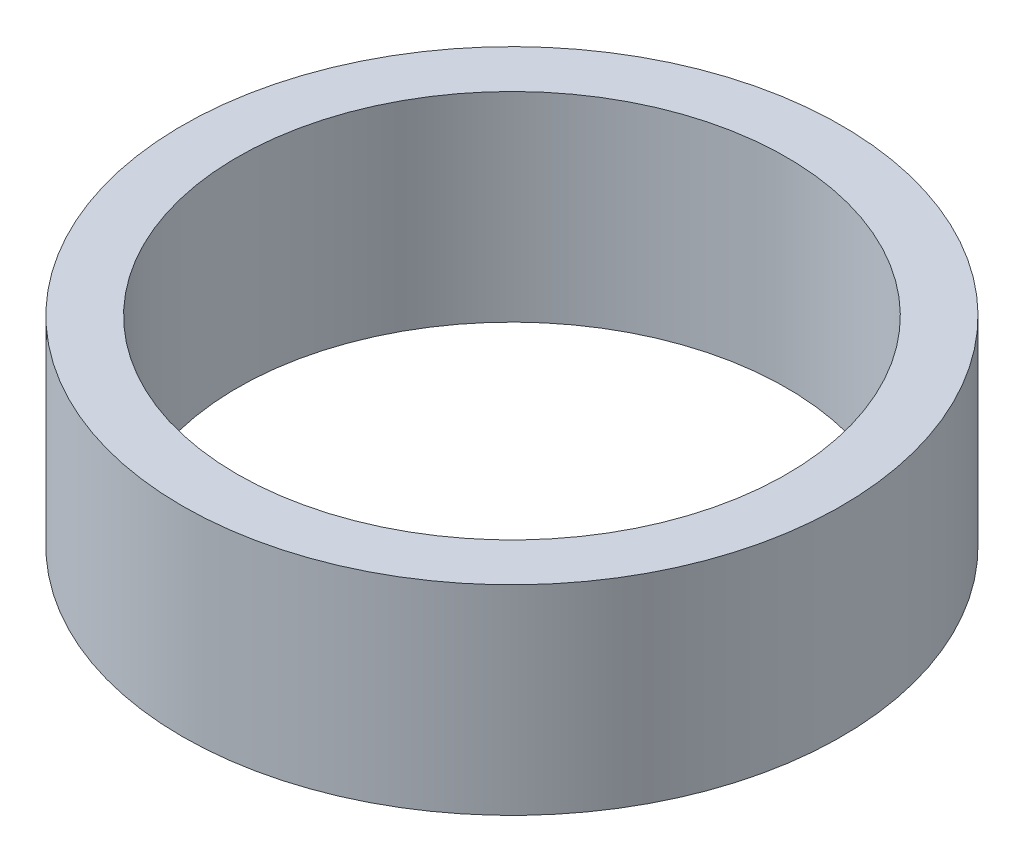
ISO-10303-21;
HEADER;
FILE_DESCRIPTION(('STEP AP214'),'2;1');
FILE_NAME('part.step','',(''),(''),'','','');
FILE_SCHEMA(('AUTOMOTIVE_DESIGN { 1 0 10303 214 1 1 1 1 }'));
ENDSEC;
DATA;
#1=APPLICATION_CONTEXT('core data for automotive mechanical design processes');
#2=APPLICATION_PROTOCOL_DEFINITION('international standard','automotive_design',2000,#1);
#3=PRODUCT_CONTEXT('',#1,'mechanical');
#4=PRODUCT('Part','Part','',(#3));
#5=PRODUCT_RELATED_PRODUCT_CATEGORY('part','',(#4));
#6=PRODUCT_DEFINITION_FORMATION('','',#4);
#7=PRODUCT_DEFINITION_CONTEXT('part definition',#1,'design');
#8=PRODUCT_DEFINITION('design','',#6,#7);
#9=PRODUCT_DEFINITION_SHAPE('','',#8);
#10=(LENGTH_UNIT() NAMED_UNIT(*) SI_UNIT(.MILLI.,.METRE.));
#11=(NAMED_UNIT(*) PLANE_ANGLE_UNIT() SI_UNIT($,.RADIAN.));
#12=(NAMED_UNIT(*) SI_UNIT($,.STERADIAN.) SOLID_ANGLE_UNIT());
#13=UNCERTAINTY_MEASURE_WITH_UNIT(LENGTH_MEASURE(1.E-05),#10,'distance_accuracy_value','');
#14=(GEOMETRIC_REPRESENTATION_CONTEXT(3) GLOBAL_UNCERTAINTY_ASSIGNED_CONTEXT((#13)) GLOBAL_UNIT_ASSIGNED_CONTEXT((#10,
#11,#12)) REPRESENTATION_CONTEXT('',''));
#15=CARTESIAN_POINT('',(0.,0.,0.));
#16=DIRECTION('',(0.,0.,1.));
#17=DIRECTION('',(1.,0.,0.));
#18=AXIS2_PLACEMENT_3D('',#15,#16,#17);
#19=CARTESIAN_POINT('',(0.,10.,0.));
#20=DIRECTION('',(0.,1.,0.));
#21=DIRECTION('',(0.,0.,1.));
#22=AXIS2_PLACEMENT_3D('',#19,#20,#21);
#23=PLANE('',#22);
#24=CARTESIAN_POINT('',(0.,10.,0.));
#25=DIRECTION('',(0.,1.,0.));
#26=DIRECTION('',(0.,0.,1.));
#27=AXIS2_PLACEMENT_3D('',#24,#25,#26);
#28=CIRCLE('',#27,16.5);
#29=CARTESIAN_POINT('',(0.,10.,16.5));
#30=VERTEX_POINT('',#29);
#31=EDGE_CURVE('E10',#30,#30,#28,.T.);
#32=ORIENTED_EDGE('',*,*,#31,.T.);
#33=EDGE_LOOP('',(#32));
#34=FACE_BOUND('',#33,.T.);
#35=CARTESIAN_POINT('',(0.,10.,0.));
#36=DIRECTION('',(0.,1.,0.));
#37=DIRECTION('',(0.,0.,1.));
#38=AXIS2_PLACEMENT_3D('',#35,#36,#37);
#39=CIRCLE('',#38,13.75);
#40=CARTESIAN_POINT('',(0.,10.,13.75));
#41=VERTEX_POINT('',#40);
#42=EDGE_CURVE('E48',#41,#41,#39,.T.);
#43=ORIENTED_EDGE('',*,*,#42,.F.);
#44=EDGE_LOOP('',(#43));
#45=FACE_BOUND('',#44,.T.);
#46=ADVANCED_FACE('F37',(#34,#45),#23,.T.);
#47=CARTESIAN_POINT('',(0.,0.,0.));
#48=DIRECTION('',(0.,1.,0.));
#49=DIRECTION('',(0.,0.,1.));
#50=AXIS2_PLACEMENT_3D('',#47,#48,#49);
#51=PLANE('',#50);
#52=CARTESIAN_POINT('',(0.,0.,0.));
#53=DIRECTION('',(0.,1.,0.));
#54=DIRECTION('',(0.,0.,1.));
#55=AXIS2_PLACEMENT_3D('',#52,#53,#54);
#56=CIRCLE('',#55,16.5);
#57=CARTESIAN_POINT('',(0.,0.,16.5));
#58=VERTEX_POINT('',#57);
#59=EDGE_CURVE('E41',#58,#58,#56,.T.);
#60=ORIENTED_EDGE('',*,*,#59,.F.);
#61=EDGE_LOOP('',(#60));
#62=FACE_BOUND('',#61,.T.);
#63=CARTESIAN_POINT('',(0.,0.,0.));
#64=DIRECTION('',(0.,1.,0.));
#65=DIRECTION('',(0.,0.,1.));
#66=AXIS2_PLACEMENT_3D('',#63,#64,#65);
#67=CIRCLE('',#66,13.75);
#68=CARTESIAN_POINT('',(0.,0.,13.75));
#69=VERTEX_POINT('',#68);
#70=EDGE_CURVE('E50',#69,#69,#67,.T.);
#71=ORIENTED_EDGE('',*,*,#70,.T.);
#72=EDGE_LOOP('',(#71));
#73=FACE_BOUND('',#72,.T.);
#74=ADVANCED_FACE('F60',(#62,#73),#51,.F.);
#75=CARTESIAN_POINT('',(0.,10.,0.));
#76=DIRECTION('',(0.,-1.,0.));
#77=DIRECTION('',(0.,0.,-1.));
#78=AXIS2_PLACEMENT_3D('',#75,#76,#77);
#79=CYLINDRICAL_SURFACE('',#78,16.5);
#80=ORIENTED_EDGE('',*,*,#31,.F.);
#81=EDGE_LOOP('',(#80));
#82=FACE_BOUND('',#81,.T.);
#83=ORIENTED_EDGE('',*,*,#59,.T.);
#84=EDGE_LOOP('',(#83));
#85=FACE_BOUND('',#84,.T.);
#86=ADVANCED_FACE('F39',(#82,#85),#79,.T.);
#87=CARTESIAN_POINT('',(0.,10.,0.));
#88=DIRECTION('',(0.,-1.,0.));
#89=DIRECTION('',(0.,0.,-1.));
#90=AXIS2_PLACEMENT_3D('',#87,#88,#89);
#91=CYLINDRICAL_SURFACE('',#90,13.75);
#92=ORIENTED_EDGE('',*,*,#42,.T.);
#93=EDGE_LOOP('',(#92));
#94=FACE_BOUND('',#93,.T.);
#95=ORIENTED_EDGE('',*,*,#70,.F.);
#96=EDGE_LOOP('',(#95));
#97=FACE_BOUND('',#96,.T.);
#98=ADVANCED_FACE('F56',(#94,#97),#91,.F.);
#99=CLOSED_SHELL('',(#46,#74,#86,#98));
#100=MANIFOLD_SOLID_BREP('B2',#99);
#101=ADVANCED_BREP_SHAPE_REPRESENTATION('',(#18,#100),#14);
#102=SHAPE_DEFINITION_REPRESENTATION(#9,#101);
ENDSEC;
END-ISO-10303-21;
